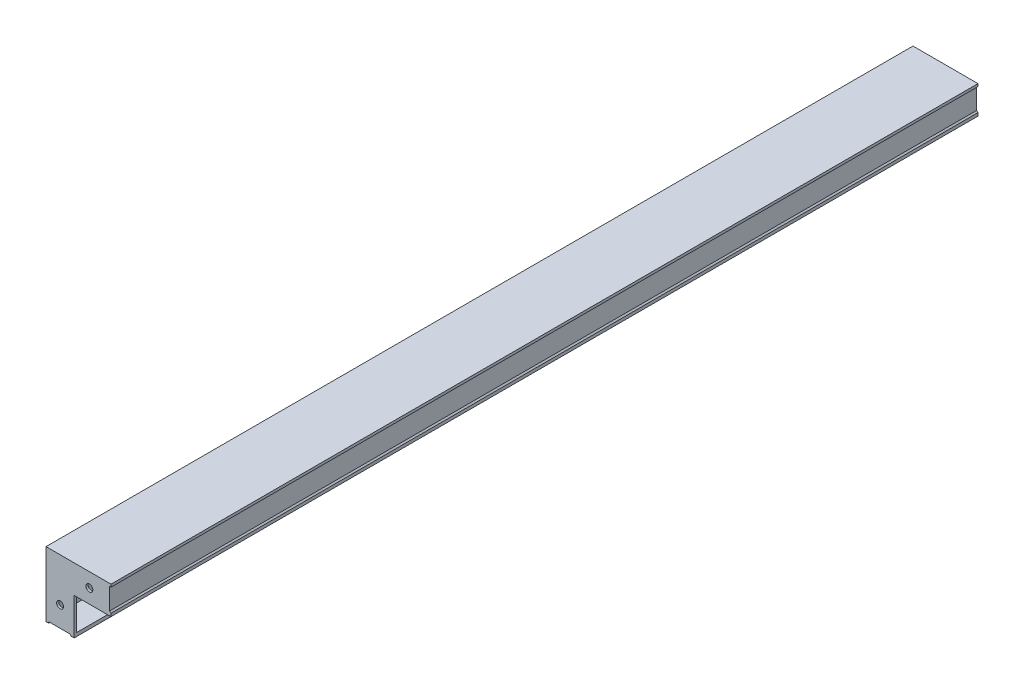
ISO-10303-21;
HEADER;
FILE_DESCRIPTION(('STEP AP214'),'2;1');
FILE_NAME('part.step','',(''),(''),'','','');
FILE_SCHEMA(('AUTOMOTIVE_DESIGN { 1 0 10303 214 1 1 1 1 }'));
ENDSEC;
DATA;
#1=APPLICATION_CONTEXT('core data for automotive mechanical design processes');
#2=APPLICATION_PROTOCOL_DEFINITION('international standard','automotive_design',2000,#1);
#3=PRODUCT_CONTEXT('',#1,'mechanical');
#4=PRODUCT('Part','Part','',(#3));
#5=PRODUCT_RELATED_PRODUCT_CATEGORY('part','',(#4));
#6=PRODUCT_DEFINITION_FORMATION('','',#4);
#7=PRODUCT_DEFINITION_CONTEXT('part definition',#1,'design');
#8=PRODUCT_DEFINITION('design','',#6,#7);
#9=PRODUCT_DEFINITION_SHAPE('','',#8);
#10=(LENGTH_UNIT() NAMED_UNIT(*) SI_UNIT(.MILLI.,.METRE.));
#11=(NAMED_UNIT(*) PLANE_ANGLE_UNIT() SI_UNIT($,.RADIAN.));
#12=(NAMED_UNIT(*) SI_UNIT($,.STERADIAN.) SOLID_ANGLE_UNIT());
#13=UNCERTAINTY_MEASURE_WITH_UNIT(LENGTH_MEASURE(1.E-05),#10,'distance_accuracy_value','');
#14=(GEOMETRIC_REPRESENTATION_CONTEXT(3) GLOBAL_UNCERTAINTY_ASSIGNED_CONTEXT((#13)) GLOBAL_UNIT_ASSIGNED_CONTEXT((#10,
#11,#12)) REPRESENTATION_CONTEXT('',''));
#15=CARTESIAN_POINT('',(0.,0.,0.));
#16=DIRECTION('',(0.,0.,1.));
#17=DIRECTION('',(1.,0.,0.));
#18=AXIS2_PLACEMENT_3D('',#15,#16,#17);
#19=CARTESIAN_POINT('',(8.99999999995733,-8.99999999998687,2000.));
#20=DIRECTION('',(0.,0.,-1.));
#21=DIRECTION('',(-1.,0.,0.));
#22=AXIS2_PLACEMENT_3D('',#19,#20,#21);
#23=CYLINDRICAL_SURFACE('',#22,2.99999999998663);
#24=DIRECTION('',(0.,0.,-1.));
#25=VECTOR('',#24,1.);
#26=CARTESIAN_POINT('',(5.9999999999707,-8.99999999998688,2000.));
#27=LINE('',#26,#25);
#28=CARTESIAN_POINT('',(5.9999999999707,-8.99999999998688,1995.));
#29=VERTEX_POINT('',#28);
#30=CARTESIAN_POINT('',(5.9999999999707,-8.99999999998688,4.99999999999989));
#31=VERTEX_POINT('',#30);
#32=EDGE_CURVE('E264',#29,#31,#27,.T.);
#33=ORIENTED_EDGE('',*,*,#32,.T.);
#34=CARTESIAN_POINT('',(8.99999999995733,-8.99999999998687,4.99999999999989));
#35=DIRECTION('',(0.,0.,1.));
#36=DIRECTION('',(1.,0.,0.));
#37=AXIS2_PLACEMENT_3D('',#34,#35,#36);
#38=CIRCLE('',#37,2.99999999998663);
#39=CARTESIAN_POINT('',(8.99999999995733,-6.00000000000025,4.99999999999989));
#40=VERTEX_POINT('',#39);
#41=EDGE_CURVE('E48',#31,#40,#38,.F.);
#42=ORIENTED_EDGE('',*,*,#41,.T.);
#43=DIRECTION('',(0.,0.,-1.));
#44=VECTOR('',#43,1.);
#45=CARTESIAN_POINT('',(8.99999999995733,-6.00000000000025,2000.));
#46=LINE('',#45,#44);
#47=CARTESIAN_POINT('',(8.99999999995733,-6.00000000000021,1995.));
#48=VERTEX_POINT('',#47);
#49=EDGE_CURVE('E11',#48,#40,#46,.T.);
#50=ORIENTED_EDGE('',*,*,#49,.F.);
#51=CARTESIAN_POINT('',(8.99999999995733,-8.99999999998687,1995.));
#52=DIRECTION('',(0.,0.,-1.));
#53=DIRECTION('',(-1.,0.,0.));
#54=AXIS2_PLACEMENT_3D('',#51,#52,#53);
#55=CIRCLE('',#54,2.99999999998663);
#56=EDGE_CURVE('E231',#48,#29,#55,.F.);
#57=ORIENTED_EDGE('',*,*,#56,.T.);
#58=EDGE_LOOP('',(#33,#42,#50,#57));
#59=FACE_BOUND('',#58,.T.);
#60=ADVANCED_FACE('F32',(#59),#23,.F.);
#61=CARTESIAN_POINT('',(8.99999999995733,-6.00000000000025,2000.));
#62=DIRECTION('',(0.,1.,0.));
#63=DIRECTION('',(-1.,0.,0.));
#64=AXIS2_PLACEMENT_3D('',#61,#62,#63);
#65=PLANE('',#64);
#66=ORIENTED_EDGE('',*,*,#49,.T.);
#67=DIRECTION('',(-1.,0.,0.));
#68=VECTOR('',#67,1.);
#69=CARTESIAN_POINT('',(5.9999999999707,-6.00000000000021,5.));
#70=LINE('',#69,#68);
#71=CARTESIAN_POINT('',(141.999999999995,-6.00000000000021,4.99999999999989));
#72=VERTEX_POINT('',#71);
#73=EDGE_CURVE('E54',#72,#40,#70,.T.);
#74=ORIENTED_EDGE('',*,*,#73,.F.);
#75=DIRECTION('',(0.,0.,-1.));
#76=VECTOR('',#75,1.);
#77=CARTESIAN_POINT('',(141.999999999995,-6.00000000000021,2000.));
#78=LINE('',#77,#76);
#79=CARTESIAN_POINT('',(141.999999999995,-6.00000000000021,1995.));
#80=VERTEX_POINT('',#79);
#81=EDGE_CURVE('E40',#80,#72,#78,.T.);
#82=ORIENTED_EDGE('',*,*,#81,.F.);
#83=DIRECTION('',(-1.,0.,0.));
#84=VECTOR('',#83,1.);
#85=CARTESIAN_POINT('',(5.9999999999707,-6.00000000000021,1995.));
#86=LINE('',#85,#84);
#87=EDGE_CURVE('E225',#80,#48,#86,.T.);
#88=ORIENTED_EDGE('',*,*,#87,.T.);
#89=EDGE_LOOP('',(#66,#74,#82,#88));
#90=FACE_BOUND('',#89,.T.);
#91=ADVANCED_FACE('F357',(#90),#65,.F.);
#92=CARTESIAN_POINT('',(141.999999999995,-64.9999999999834,2000.));
#93=DIRECTION('',(1.,0.,0.));
#94=DIRECTION('',(0.,0.,-1.));
#95=AXIS2_PLACEMENT_3D('',#92,#93,#94);
#96=PLANE('',#95);
#97=ORIENTED_EDGE('',*,*,#81,.T.);
#98=DIRECTION('',(0.,1.,0.));
#99=VECTOR('',#98,1.);
#100=CARTESIAN_POINT('',(141.999999999995,-64.9999999999834,5.));
#101=LINE('',#100,#99);
#102=CARTESIAN_POINT('',(141.999999999995,-64.9999999999834,4.99999999999989));
#103=VERTEX_POINT('',#102);
#104=EDGE_CURVE('E204',#103,#72,#101,.T.);
#105=ORIENTED_EDGE('',*,*,#104,.F.);
#106=DIRECTION('',(0.,0.,-1.));
#107=VECTOR('',#106,1.);
#108=CARTESIAN_POINT('',(141.999999999995,-64.9999999999834,2000.));
#109=LINE('',#108,#107);
#110=CARTESIAN_POINT('',(141.999999999995,-64.9999999999834,1995.));
#111=VERTEX_POINT('',#110);
#112=EDGE_CURVE('E203',#111,#103,#109,.T.);
#113=ORIENTED_EDGE('',*,*,#112,.F.);
#114=DIRECTION('',(0.,1.,0.));
#115=VECTOR('',#114,1.);
#116=CARTESIAN_POINT('',(141.999999999995,-64.9999999999834,1995.));
#117=LINE('',#116,#115);
#118=EDGE_CURVE('E222',#111,#80,#117,.T.);
#119=ORIENTED_EDGE('',*,*,#118,.T.);
#120=EDGE_LOOP('',(#97,#105,#113,#119));
#121=FACE_BOUND('',#120,.T.);
#122=ADVANCED_FACE('F356',(#121),#96,.F.);
#123=CARTESIAN_POINT('',(150.,-64.9999999999834,2000.));
#124=DIRECTION('',(0.,1.,0.));
#125=DIRECTION('',(0.,0.,1.));
#126=AXIS2_PLACEMENT_3D('',#123,#124,#125);
#127=PLANE('',#126);
#128=DIRECTION('',(1.,0.,0.));
#129=VECTOR('',#128,1.);
#130=CARTESIAN_POINT('',(150.,-64.9999999999834,0.));
#131=LINE('',#130,#129);
#132=CARTESIAN_POINT('',(64.9999999999995,-64.9999999999834,0.));
#133=VERTEX_POINT('',#132);
#134=CARTESIAN_POINT('',(150.,-64.9999999999834,0.));
#135=VERTEX_POINT('',#134);
#136=EDGE_CURVE('E234',#133,#135,#131,.T.);
#137=ORIENTED_EDGE('',*,*,#136,.T.);
#138=DIRECTION('',(0.,0.,-1.));
#139=VECTOR('',#138,1.);
#140=CARTESIAN_POINT('',(150.,-64.9999999999834,2000.));
#141=LINE('',#140,#139);
#142=CARTESIAN_POINT('',(150.,-64.9999999999834,2000.));
#143=VERTEX_POINT('',#142);
#144=EDGE_CURVE('E332',#143,#135,#141,.T.);
#145=ORIENTED_EDGE('',*,*,#144,.F.);
#146=DIRECTION('',(1.,0.,0.));
#147=VECTOR('',#146,1.);
#148=CARTESIAN_POINT('',(150.,-64.9999999999834,2000.));
#149=LINE('',#148,#147);
#150=CARTESIAN_POINT('',(64.9999999999995,-64.9999999999834,2000.));
#151=VERTEX_POINT('',#150);
#152=EDGE_CURVE('E235',#151,#143,#149,.T.);
#153=ORIENTED_EDGE('',*,*,#152,.F.);
#154=DIRECTION('',(0.,0.,1.));
#155=VECTOR('',#154,1.);
#156=CARTESIAN_POINT('',(64.9999999999995,-64.9999999999834,1995.));
#157=LINE('',#156,#155);
#158=CARTESIAN_POINT('',(64.9999999999995,-64.9999999999834,1995.));
#159=VERTEX_POINT('',#158);
#160=EDGE_CURVE('E228',#159,#151,#157,.T.);
#161=ORIENTED_EDGE('',*,*,#160,.F.);
#162=DIRECTION('',(1.,0.,0.));
#163=VECTOR('',#162,1.);
#164=CARTESIAN_POINT('',(141.999999999995,-64.9999999999834,1995.));
#165=LINE('',#164,#163);
#166=EDGE_CURVE('E220',#159,#111,#165,.T.);
#167=ORIENTED_EDGE('',*,*,#166,.T.);
#168=ORIENTED_EDGE('',*,*,#112,.T.);
#169=DIRECTION('',(1.,0.,0.));
#170=VECTOR('',#169,1.);
#171=CARTESIAN_POINT('',(141.999999999995,-64.9999999999834,5.));
#172=LINE('',#171,#170);
#173=CARTESIAN_POINT('',(64.9999999999995,-64.9999999999834,5.));
#174=VERTEX_POINT('',#173);
#175=EDGE_CURVE('E184',#174,#103,#172,.T.);
#176=ORIENTED_EDGE('',*,*,#175,.F.);
#177=DIRECTION('',(0.,0.,-1.));
#178=VECTOR('',#177,1.);
#179=CARTESIAN_POINT('',(64.9999999999995,-64.9999999999834,5.));
#180=LINE('',#179,#178);
#181=EDGE_CURVE('E191',#174,#133,#180,.T.);
#182=ORIENTED_EDGE('',*,*,#181,.T.);
#183=EDGE_LOOP('',(#137,#145,#153,#161,#167,#168,#176,#182));
#184=FACE_BOUND('',#183,.T.);
#185=ADVANCED_FACE('F200',(#184),#127,.F.);
#186=CARTESIAN_POINT('',(150.,-57.9999999999965,2000.));
#187=DIRECTION('',(-1.,0.,0.));
#188=DIRECTION('',(0.,0.,1.));
#189=AXIS2_PLACEMENT_3D('',#186,#187,#188);
#190=PLANE('',#189);
#191=DIRECTION('',(0.,1.,0.));
#192=VECTOR('',#191,1.);
#193=CARTESIAN_POINT('',(150.,-57.9999999999965,0.));
#194=LINE('',#193,#192);
#195=CARTESIAN_POINT('',(150.,-57.9999999999965,0.));
#196=VERTEX_POINT('',#195);
#197=EDGE_CURVE('E266',#135,#196,#194,.T.);
#198=ORIENTED_EDGE('',*,*,#197,.T.);
#199=DIRECTION('',(0.,0.,-1.));
#200=VECTOR('',#199,1.);
#201=CARTESIAN_POINT('',(150.,-57.9999999999965,2000.));
#202=LINE('',#201,#200);
#203=CARTESIAN_POINT('',(150.,-57.9999999999965,2000.));
#204=VERTEX_POINT('',#203);
#205=EDGE_CURVE('E329',#204,#196,#202,.T.);
#206=ORIENTED_EDGE('',*,*,#205,.F.);
#207=DIRECTION('',(0.,1.,0.));
#208=VECTOR('',#207,1.);
#209=CARTESIAN_POINT('',(150.,-57.9999999999965,2000.));
#210=LINE('',#209,#208);
#211=EDGE_CURVE('E237',#143,#204,#210,.T.);
#212=ORIENTED_EDGE('',*,*,#211,.F.);
#213=ORIENTED_EDGE('',*,*,#144,.T.);
#214=EDGE_LOOP('',(#198,#206,#212,#213));
#215=FACE_BOUND('',#214,.T.);
#216=ADVANCED_FACE('F382',(#215),#190,.F.);
#217=CARTESIAN_POINT('',(147.000000000021,-55.0000000000175,2000.));
#218=DIRECTION('',(-0.707106781186532,-0.707106781186563,0.));
#219=DIRECTION('',(0.707106781186563,-0.707106781186532,0.));
#220=AXIS2_PLACEMENT_3D('',#217,#218,#219);
#221=PLANE('',#220);
#222=DIRECTION('',(-0.707106781186563,0.707106781186532,0.));
#223=VECTOR('',#222,1.);
#224=CARTESIAN_POINT('',(147.000000000021,-55.0000000000175,0.));
#225=LINE('',#224,#223);
#226=CARTESIAN_POINT('',(147.000000000021,-55.0000000000175,0.));
#227=VERTEX_POINT('',#226);
#228=EDGE_CURVE('E268',#196,#227,#225,.T.);
#229=ORIENTED_EDGE('',*,*,#228,.T.);
#230=DIRECTION('',(0.,0.,-1.));
#231=VECTOR('',#230,1.);
#232=CARTESIAN_POINT('',(147.000000000021,-55.0000000000175,2000.));
#233=LINE('',#232,#231);
#234=CARTESIAN_POINT('',(147.000000000021,-55.0000000000175,2000.));
#235=VERTEX_POINT('',#234);
#236=EDGE_CURVE('E326',#235,#227,#233,.T.);
#237=ORIENTED_EDGE('',*,*,#236,.F.);
#238=DIRECTION('',(-0.707106781186563,0.707106781186532,0.));
#239=VECTOR('',#238,1.);
#240=CARTESIAN_POINT('',(147.000000000021,-55.0000000000175,2000.));
#241=LINE('',#240,#239);
#242=EDGE_CURVE('E239',#204,#235,#241,.T.);
#243=ORIENTED_EDGE('',*,*,#242,.F.);
#244=ORIENTED_EDGE('',*,*,#205,.T.);
#245=EDGE_LOOP('',(#229,#237,#243,#244));
#246=FACE_BOUND('',#245,.T.);
#247=ADVANCED_FACE('F389',(#246),#221,.F.);
#248=CARTESIAN_POINT('',(147.000000000021,-6.00000000000021,2000.));
#249=DIRECTION('',(-1.,0.,0.));
#250=DIRECTION('',(0.,-1.,0.));
#251=AXIS2_PLACEMENT_3D('',#248,#249,#250);
#252=PLANE('',#251);
#253=DIRECTION('',(0.,1.,0.));
#254=VECTOR('',#253,1.);
#255=CARTESIAN_POINT('',(147.000000000021,-6.00000000000021,0.));
#256=LINE('',#255,#254);
#257=CARTESIAN_POINT('',(147.000000000021,-6.00000000000021,0.));
#258=VERTEX_POINT('',#257);
#259=EDGE_CURVE('E270',#227,#258,#256,.T.);
#260=ORIENTED_EDGE('',*,*,#259,.T.);
#261=DIRECTION('',(0.,0.,-1.));
#262=VECTOR('',#261,1.);
#263=CARTESIAN_POINT('',(147.000000000021,-6.00000000000021,2000.));
#264=LINE('',#263,#262);
#265=CARTESIAN_POINT('',(147.000000000021,-6.00000000000021,2000.));
#266=VERTEX_POINT('',#265);
#267=EDGE_CURVE('E323',#266,#258,#264,.T.);
#268=ORIENTED_EDGE('',*,*,#267,.F.);
#269=DIRECTION('',(0.,1.,0.));
#270=VECTOR('',#269,1.);
#271=CARTESIAN_POINT('',(147.000000000021,-6.00000000000021,2000.));
#272=LINE('',#271,#270);
#273=EDGE_CURVE('E241',#235,#266,#272,.T.);
#274=ORIENTED_EDGE('',*,*,#273,.F.);
#275=ORIENTED_EDGE('',*,*,#236,.T.);
#276=EDGE_LOOP('',(#260,#268,#274,#275));
#277=FACE_BOUND('',#276,.T.);
#278=ADVANCED_FACE('F392',(#277),#252,.F.);
#279=CARTESIAN_POINT('',(147.000000000021,-6.00000000000021,2000.));
#280=DIRECTION('',(0.,1.,0.));
#281=DIRECTION('',(-1.,0.,0.));
#282=AXIS2_PLACEMENT_3D('',#279,#280,#281);
#283=PLANE('',#282);
#284=DIRECTION('',(1.,0.,0.));
#285=VECTOR('',#284,1.);
#286=CARTESIAN_POINT('',(147.000000000021,-6.00000000000021,0.));
#287=LINE('',#286,#285);
#288=CARTESIAN_POINT('',(150.,-6.0000000000002,0.));
#289=VERTEX_POINT('',#288);
#290=EDGE_CURVE('E272',#258,#289,#287,.T.);
#291=ORIENTED_EDGE('',*,*,#290,.T.);
#292=DIRECTION('',(0.,0.,-1.));
#293=VECTOR('',#292,1.);
#294=CARTESIAN_POINT('',(150.,-6.0000000000002,2000.));
#295=LINE('',#294,#293);
#296=CARTESIAN_POINT('',(150.,-6.0000000000002,2000.));
#297=VERTEX_POINT('',#296);
#298=EDGE_CURVE('E320',#297,#289,#295,.T.);
#299=ORIENTED_EDGE('',*,*,#298,.F.);
#300=DIRECTION('',(1.,0.,0.));
#301=VECTOR('',#300,1.);
#302=CARTESIAN_POINT('',(147.000000000021,-6.00000000000021,2000.));
#303=LINE('',#302,#301);
#304=EDGE_CURVE('E243',#266,#297,#303,.T.);
#305=ORIENTED_EDGE('',*,*,#304,.F.);
#306=ORIENTED_EDGE('',*,*,#267,.T.);
#307=EDGE_LOOP('',(#291,#299,#305,#306));
#308=FACE_BOUND('',#307,.T.);
#309=ADVANCED_FACE('F397',(#308),#283,.F.);
#310=CARTESIAN_POINT('',(150.,0.,2000.));
#311=DIRECTION('',(-1.,0.,0.));
#312=DIRECTION('',(0.,0.,1.));
#313=AXIS2_PLACEMENT_3D('',#310,#311,#312);
#314=PLANE('',#313);
#315=DIRECTION('',(0.,1.,0.));
#316=VECTOR('',#315,1.);
#317=CARTESIAN_POINT('',(150.,0.,0.));
#318=LINE('',#317,#316);
#319=CARTESIAN_POINT('',(150.,0.,0.));
#320=VERTEX_POINT('',#319);
#321=EDGE_CURVE('E274',#289,#320,#318,.T.);
#322=ORIENTED_EDGE('',*,*,#321,.T.);
#323=DIRECTION('',(0.,0.,-1.));
#324=VECTOR('',#323,1.);
#325=CARTESIAN_POINT('',(150.,0.,2000.));
#326=LINE('',#325,#324);
#327=CARTESIAN_POINT('',(150.,0.,2000.));
#328=VERTEX_POINT('',#327);
#329=EDGE_CURVE('E317',#328,#320,#326,.T.);
#330=ORIENTED_EDGE('',*,*,#329,.F.);
#331=DIRECTION('',(0.,1.,0.));
#332=VECTOR('',#331,1.);
#333=CARTESIAN_POINT('',(150.,0.,2000.));
#334=LINE('',#333,#332);
#335=EDGE_CURVE('E245',#297,#328,#334,.T.);
#336=ORIENTED_EDGE('',*,*,#335,.F.);
#337=ORIENTED_EDGE('',*,*,#298,.T.);
#338=EDGE_LOOP('',(#322,#330,#336,#337));
#339=FACE_BOUND('',#338,.T.);
#340=ADVANCED_FACE('F403',(#339),#314,.F.);
#341=CARTESIAN_POINT('',(150.,0.,2000.));
#342=DIRECTION('',(0.,-1.,0.));
#343=DIRECTION('',(1.,0.,0.));
#344=AXIS2_PLACEMENT_3D('',#341,#342,#343);
#345=PLANE('',#344);
#346=DIRECTION('',(-1.,0.,0.));
#347=VECTOR('',#346,1.);
#348=CARTESIAN_POINT('',(150.,0.,0.));
#349=LINE('',#348,#347);
#350=CARTESIAN_POINT('',(0.,0.,0.));
#351=VERTEX_POINT('',#350);
#352=EDGE_CURVE('E276',#320,#351,#349,.T.);
#353=ORIENTED_EDGE('',*,*,#352,.T.);
#354=DIRECTION('',(0.,0.,-1.));
#355=VECTOR('',#354,1.);
#356=CARTESIAN_POINT('',(0.,0.,2000.));
#357=LINE('',#356,#355);
#358=CARTESIAN_POINT('',(0.,0.,2000.));
#359=VERTEX_POINT('',#358);
#360=EDGE_CURVE('E314',#359,#351,#357,.T.);
#361=ORIENTED_EDGE('',*,*,#360,.F.);
#362=DIRECTION('',(-1.,0.,0.));
#363=VECTOR('',#362,1.);
#364=CARTESIAN_POINT('',(150.,0.,2000.));
#365=LINE('',#364,#363);
#366=EDGE_CURVE('E247',#328,#359,#365,.T.);
#367=ORIENTED_EDGE('',*,*,#366,.F.);
#368=ORIENTED_EDGE('',*,*,#329,.T.);
#369=EDGE_LOOP('',(#353,#361,#367,#368));
#370=FACE_BOUND('',#369,.T.);
#371=ADVANCED_FACE('F407',(#370),#345,.F.);
#372=CARTESIAN_POINT('',(0.,-149.999999999985,2000.));
#373=DIRECTION('',(1.,0.,0.));
#374=DIRECTION('',(0.,0.,-1.));
#375=AXIS2_PLACEMENT_3D('',#372,#373,#374);
#376=PLANE('',#375);
#377=DIRECTION('',(0.,-1.,0.));
#378=VECTOR('',#377,1.);
#379=CARTESIAN_POINT('',(0.,-149.999999999985,0.));
#380=LINE('',#379,#378);
#381=CARTESIAN_POINT('',(0.,-149.999999999985,0.));
#382=VERTEX_POINT('',#381);
#383=EDGE_CURVE('E278',#351,#382,#380,.T.);
#384=ORIENTED_EDGE('',*,*,#383,.T.);
#385=DIRECTION('',(0.,0.,-1.));
#386=VECTOR('',#385,1.);
#387=CARTESIAN_POINT('',(0.,-149.999999999985,2000.));
#388=LINE('',#387,#386);
#389=CARTESIAN_POINT('',(0.,-149.999999999985,2000.));
#390=VERTEX_POINT('',#389);
#391=EDGE_CURVE('E311',#390,#382,#388,.T.);
#392=ORIENTED_EDGE('',*,*,#391,.F.);
#393=DIRECTION('',(0.,-1.,0.));
#394=VECTOR('',#393,1.);
#395=CARTESIAN_POINT('',(0.,-149.999999999985,2000.));
#396=LINE('',#395,#394);
#397=EDGE_CURVE('E249',#359,#390,#396,.T.);
#398=ORIENTED_EDGE('',*,*,#397,.F.);
#399=ORIENTED_EDGE('',*,*,#360,.T.);
#400=EDGE_LOOP('',(#384,#392,#398,#399));
#401=FACE_BOUND('',#400,.T.);
#402=ADVANCED_FACE('F412',(#401),#376,.F.);
#403=CARTESIAN_POINT('',(5.9999999999707,-149.999999999985,2000.));
#404=DIRECTION('',(0.,1.,0.));
#405=DIRECTION('',(0.,0.,1.));
#406=AXIS2_PLACEMENT_3D('',#403,#404,#405);
#407=PLANE('',#406);
#408=DIRECTION('',(1.,0.,0.));
#409=VECTOR('',#408,1.);
#410=CARTESIAN_POINT('',(5.9999999999707,-149.999999999985,0.));
#411=LINE('',#410,#409);
#412=CARTESIAN_POINT('',(5.9999999999707,-149.999999999985,0.));
#413=VERTEX_POINT('',#412);
#414=EDGE_CURVE('E280',#382,#413,#411,.T.);
#415=ORIENTED_EDGE('',*,*,#414,.T.);
#416=DIRECTION('',(0.,0.,-1.));
#417=VECTOR('',#416,1.);
#418=CARTESIAN_POINT('',(5.9999999999707,-149.999999999985,2000.));
#419=LINE('',#418,#417);
#420=CARTESIAN_POINT('',(5.9999999999707,-149.999999999985,2000.));
#421=VERTEX_POINT('',#420);
#422=EDGE_CURVE('E308',#421,#413,#419,.T.);
#423=ORIENTED_EDGE('',*,*,#422,.F.);
#424=DIRECTION('',(1.,0.,0.));
#425=VECTOR('',#424,1.);
#426=CARTESIAN_POINT('',(5.9999999999707,-149.999999999985,2000.));
#427=LINE('',#426,#425);
#428=EDGE_CURVE('E251',#390,#421,#427,.T.);
#429=ORIENTED_EDGE('',*,*,#428,.F.);
#430=ORIENTED_EDGE('',*,*,#391,.T.);
#431=EDGE_LOOP('',(#415,#423,#429,#430));
#432=FACE_BOUND('',#431,.T.);
#433=ADVANCED_FACE('F418',(#432),#407,.F.);
#434=CARTESIAN_POINT('',(5.9999999999707,-149.999999999985,2000.));
#435=DIRECTION('',(-1.,0.,0.));
#436=DIRECTION('',(0.,-1.,0.));
#437=AXIS2_PLACEMENT_3D('',#434,#435,#436);
#438=PLANE('',#437);
#439=DIRECTION('',(0.,1.,0.));
#440=VECTOR('',#439,1.);
#441=CARTESIAN_POINT('',(5.9999999999707,-149.999999999985,0.));
#442=LINE('',#441,#440);
#443=CARTESIAN_POINT('',(5.9999999999707,-146.999999999985,0.));
#444=VERTEX_POINT('',#443);
#445=EDGE_CURVE('E282',#413,#444,#442,.T.);
#446=ORIENTED_EDGE('',*,*,#445,.T.);
#447=DIRECTION('',(0.,0.,-1.));
#448=VECTOR('',#447,1.);
#449=CARTESIAN_POINT('',(5.9999999999707,-146.999999999985,2000.));
#450=LINE('',#449,#448);
#451=CARTESIAN_POINT('',(5.9999999999707,-146.999999999985,2000.));
#452=VERTEX_POINT('',#451);
#453=EDGE_CURVE('E305',#452,#444,#450,.T.);
#454=ORIENTED_EDGE('',*,*,#453,.F.);
#455=DIRECTION('',(0.,1.,0.));
#456=VECTOR('',#455,1.);
#457=CARTESIAN_POINT('',(5.9999999999707,-149.999999999985,2000.));
#458=LINE('',#457,#456);
#459=EDGE_CURVE('E253',#421,#452,#458,.T.);
#460=ORIENTED_EDGE('',*,*,#459,.F.);
#461=ORIENTED_EDGE('',*,*,#422,.T.);
#462=EDGE_LOOP('',(#446,#454,#460,#461));
#463=FACE_BOUND('',#462,.T.);
#464=ADVANCED_FACE('F422',(#463),#438,.F.);
#465=CARTESIAN_POINT('',(54.9999999999997,-146.999999999985,2000.));
#466=DIRECTION('',(0.,1.,0.));
#467=DIRECTION('',(0.,0.,1.));
#468=AXIS2_PLACEMENT_3D('',#465,#466,#467);
#469=PLANE('',#468);
#470=DIRECTION('',(1.,0.,0.));
#471=VECTOR('',#470,1.);
#472=CARTESIAN_POINT('',(54.9999999999997,-146.999999999985,0.));
#473=LINE('',#472,#471);
#474=CARTESIAN_POINT('',(54.9999999999997,-146.999999999985,0.));
#475=VERTEX_POINT('',#474);
#476=EDGE_CURVE('E284',#444,#475,#473,.T.);
#477=ORIENTED_EDGE('',*,*,#476,.T.);
#478=DIRECTION('',(0.,0.,-1.));
#479=VECTOR('',#478,1.);
#480=CARTESIAN_POINT('',(54.9999999999997,-146.999999999985,2000.));
#481=LINE('',#480,#479);
#482=CARTESIAN_POINT('',(54.9999999999997,-146.999999999985,2000.));
#483=VERTEX_POINT('',#482);
#484=EDGE_CURVE('E302',#483,#475,#481,.T.);
#485=ORIENTED_EDGE('',*,*,#484,.F.);
#486=DIRECTION('',(1.,0.,0.));
#487=VECTOR('',#486,1.);
#488=CARTESIAN_POINT('',(54.9999999999997,-146.999999999985,2000.));
#489=LINE('',#488,#487);
#490=EDGE_CURVE('E255',#452,#483,#489,.T.);
#491=ORIENTED_EDGE('',*,*,#490,.F.);
#492=ORIENTED_EDGE('',*,*,#453,.T.);
#493=EDGE_LOOP('',(#477,#485,#491,#492));
#494=FACE_BOUND('',#493,.T.);
#495=ADVANCED_FACE('F427',(#494),#469,.F.);
#496=CARTESIAN_POINT('',(57.9999999999998,-149.999999999985,2000.));
#497=DIRECTION('',(0.707106781186547,0.707106781186548,0.));
#498=DIRECTION('',(-0.707106781186548,0.707106781186547,0.));
#499=AXIS2_PLACEMENT_3D('',#496,#497,#498);
#500=PLANE('',#499);
#501=DIRECTION('',(0.707106781186548,-0.707106781186547,0.));
#502=VECTOR('',#501,1.);
#503=CARTESIAN_POINT('',(57.9999999999998,-149.999999999985,0.));
#504=LINE('',#503,#502);
#505=CARTESIAN_POINT('',(57.9999999999998,-149.999999999985,0.));
#506=VERTEX_POINT('',#505);
#507=EDGE_CURVE('E286',#475,#506,#504,.T.);
#508=ORIENTED_EDGE('',*,*,#507,.T.);
#509=DIRECTION('',(0.,0.,-1.));
#510=VECTOR('',#509,1.);
#511=CARTESIAN_POINT('',(57.9999999999998,-149.999999999985,2000.));
#512=LINE('',#511,#510);
#513=CARTESIAN_POINT('',(57.9999999999998,-149.999999999985,2000.));
#514=VERTEX_POINT('',#513);
#515=EDGE_CURVE('E299',#514,#506,#512,.T.);
#516=ORIENTED_EDGE('',*,*,#515,.F.);
#517=DIRECTION('',(0.707106781186548,-0.707106781186547,0.));
#518=VECTOR('',#517,1.);
#519=CARTESIAN_POINT('',(57.9999999999998,-149.999999999985,2000.));
#520=LINE('',#519,#518);
#521=EDGE_CURVE('E257',#483,#514,#520,.T.);
#522=ORIENTED_EDGE('',*,*,#521,.F.);
#523=ORIENTED_EDGE('',*,*,#484,.T.);
#524=EDGE_LOOP('',(#508,#516,#522,#523));
#525=FACE_BOUND('',#524,.T.);
#526=ADVANCED_FACE('F431',(#525),#500,.F.);
#527=CARTESIAN_POINT('',(57.9999999999998,-149.999999999985,2000.));
#528=DIRECTION('',(0.,1.,0.));
#529=DIRECTION('',(0.,0.,1.));
#530=AXIS2_PLACEMENT_3D('',#527,#528,#529);
#531=PLANE('',#530);
#532=DIRECTION('',(1.,0.,0.));
#533=VECTOR('',#532,1.);
#534=CARTESIAN_POINT('',(57.9999999999998,-149.999999999985,0.));
#535=LINE('',#534,#533);
#536=CARTESIAN_POINT('',(64.9999999999995,-149.999999999985,0.));
#537=VERTEX_POINT('',#536);
#538=EDGE_CURVE('E288',#506,#537,#535,.T.);
#539=ORIENTED_EDGE('',*,*,#538,.T.);
#540=DIRECTION('',(0.,0.,-1.));
#541=VECTOR('',#540,1.);
#542=CARTESIAN_POINT('',(64.9999999999995,-149.999999999985,2000.));
#543=LINE('',#542,#541);
#544=CARTESIAN_POINT('',(64.9999999999995,-149.999999999985,2000.));
#545=VERTEX_POINT('',#544);
#546=EDGE_CURVE('E297',#545,#537,#543,.T.);
#547=ORIENTED_EDGE('',*,*,#546,.F.);
#548=DIRECTION('',(1.,0.,0.));
#549=VECTOR('',#548,1.);
#550=CARTESIAN_POINT('',(57.9999999999998,-149.999999999985,2000.));
#551=LINE('',#550,#549);
#552=EDGE_CURVE('E259',#514,#545,#551,.T.);
#553=ORIENTED_EDGE('',*,*,#552,.F.);
#554=ORIENTED_EDGE('',*,*,#515,.T.);
#555=EDGE_LOOP('',(#539,#547,#553,#554));
#556=FACE_BOUND('',#555,.T.);
#557=ADVANCED_FACE('F432',(#556),#531,.F.);
#558=CARTESIAN_POINT('',(64.9999999999995,-149.999999999985,2000.));
#559=DIRECTION('',(-1.,0.,0.));
#560=DIRECTION('',(0.,0.,1.));
#561=AXIS2_PLACEMENT_3D('',#558,#559,#560);
#562=PLANE('',#561);
#563=DIRECTION('',(0.,1.,0.));
#564=VECTOR('',#563,1.);
#565=CARTESIAN_POINT('',(64.9999999999995,-149.999999999985,0.));
#566=LINE('',#565,#564);
#567=EDGE_CURVE('E195',#537,#133,#566,.T.);
#568=ORIENTED_EDGE('',*,*,#567,.T.);
#569=ORIENTED_EDGE('',*,*,#181,.F.);
#570=DIRECTION('',(0.,1.,0.));
#571=VECTOR('',#570,1.);
#572=CARTESIAN_POINT('',(64.9999999999995,-141.999999999999,5.));
#573=LINE('',#572,#571);
#574=CARTESIAN_POINT('',(64.9999999999995,-141.999999999999,4.99999999999989));
#575=VERTEX_POINT('',#574);
#576=EDGE_CURVE('E179',#575,#174,#573,.T.);
#577=ORIENTED_EDGE('',*,*,#576,.F.);
#578=DIRECTION('',(0.,0.,-1.));
#579=VECTOR('',#578,1.);
#580=CARTESIAN_POINT('',(64.9999999999995,-141.999999999999,2000.));
#581=LINE('',#580,#579);
#582=CARTESIAN_POINT('',(64.9999999999995,-141.999999999999,1995.));
#583=VERTEX_POINT('',#582);
#584=EDGE_CURVE('E295',#583,#575,#581,.T.);
#585=ORIENTED_EDGE('',*,*,#584,.F.);
#586=DIRECTION('',(0.,1.,0.));
#587=VECTOR('',#586,1.);
#588=CARTESIAN_POINT('',(64.9999999999995,-141.999999999999,1995.));
#589=LINE('',#588,#587);
#590=EDGE_CURVE('E217',#583,#159,#589,.T.);
#591=ORIENTED_EDGE('',*,*,#590,.T.);
#592=ORIENTED_EDGE('',*,*,#160,.T.);
#593=DIRECTION('',(0.,1.,0.));
#594=VECTOR('',#593,1.);
#595=CARTESIAN_POINT('',(64.9999999999995,-149.999999999985,2000.));
#596=LINE('',#595,#594);
#597=EDGE_CURVE('E261',#545,#151,#596,.T.);
#598=ORIENTED_EDGE('',*,*,#597,.F.);
#599=ORIENTED_EDGE('',*,*,#546,.T.);
#600=EDGE_LOOP('',(#568,#569,#577,#585,#591,#592,#598,#599));
#601=FACE_BOUND('',#600,.T.);
#602=ADVANCED_FACE('F192',(#601),#562,.F.);
#603=CARTESIAN_POINT('',(5.9999999999707,-141.999999999999,2000.));
#604=DIRECTION('',(0.,-1.,0.));
#605=DIRECTION('',(0.,0.,-1.));
#606=AXIS2_PLACEMENT_3D('',#603,#604,#605);
#607=PLANE('',#606);
#608=ORIENTED_EDGE('',*,*,#584,.T.);
#609=DIRECTION('',(1.,0.,0.));
#610=VECTOR('',#609,1.);
#611=CARTESIAN_POINT('',(5.9999999999707,-141.999999999999,5.));
#612=LINE('',#611,#610);
#613=CARTESIAN_POINT('',(5.9999999999707,-141.999999999999,4.99999999999989));
#614=VERTEX_POINT('',#613);
#615=EDGE_CURVE('E186',#614,#575,#612,.T.);
#616=ORIENTED_EDGE('',*,*,#615,.F.);
#617=DIRECTION('',(0.,0.,-1.));
#618=VECTOR('',#617,1.);
#619=CARTESIAN_POINT('',(5.9999999999707,-141.999999999999,2000.));
#620=LINE('',#619,#618);
#621=CARTESIAN_POINT('',(5.9999999999707,-141.999999999999,1995.));
#622=VERTEX_POINT('',#621);
#623=EDGE_CURVE('E292',#622,#614,#620,.T.);
#624=ORIENTED_EDGE('',*,*,#623,.F.);
#625=DIRECTION('',(1.,0.,0.));
#626=VECTOR('',#625,1.);
#627=CARTESIAN_POINT('',(5.9999999999707,-141.999999999999,1995.));
#628=LINE('',#627,#626);
#629=EDGE_CURVE('E214',#622,#583,#628,.T.);
#630=ORIENTED_EDGE('',*,*,#629,.T.);
#631=EDGE_LOOP('',(#608,#616,#624,#630));
#632=FACE_BOUND('',#631,.T.);
#633=ADVANCED_FACE('F364',(#632),#607,.F.);
#634=CARTESIAN_POINT('',(5.9999999999707,-141.999999999999,2000.));
#635=DIRECTION('',(-1.,0.,0.));
#636=DIRECTION('',(0.,0.,1.));
#637=AXIS2_PLACEMENT_3D('',#634,#635,#636);
#638=PLANE('',#637);
#639=ORIENTED_EDGE('',*,*,#623,.T.);
#640=DIRECTION('',(0.,-1.,0.));
#641=VECTOR('',#640,1.);
#642=CARTESIAN_POINT('',(5.9999999999707,-141.999999999999,5.));
#643=LINE('',#642,#641);
#644=EDGE_CURVE('E343',#31,#614,#643,.T.);
#645=ORIENTED_EDGE('',*,*,#644,.F.);
#646=ORIENTED_EDGE('',*,*,#32,.F.);
#647=DIRECTION('',(0.,-1.,0.));
#648=VECTOR('',#647,1.);
#649=CARTESIAN_POINT('',(5.9999999999707,-141.999999999999,1995.));
#650=LINE('',#649,#648);
#651=EDGE_CURVE('E211',#29,#622,#650,.T.);
#652=ORIENTED_EDGE('',*,*,#651,.T.);
#653=EDGE_LOOP('',(#639,#645,#646,#652));
#654=FACE_BOUND('',#653,.T.);
#655=ADVANCED_FACE('F361',(#654),#638,.F.);
#656=CARTESIAN_POINT('',(8.99999999995733,-8.99999999998687,2000.));
#657=DIRECTION('',(0.,0.,1.));
#658=DIRECTION('',(1.,0.,0.));
#659=AXIS2_PLACEMENT_3D('',#656,#657,#658);
#660=PLANE('',#659);
#661=CARTESIAN_POINT('',(100.,-32.5,2000.));
#662=DIRECTION('',(0.,0.,1.));
#663=DIRECTION('',(1.,0.,0.));
#664=AXIS2_PLACEMENT_3D('',#661,#662,#663);
#665=CIRCLE('',#664,7.99999999999999);
#666=CARTESIAN_POINT('',(108.,-32.5,2000.));
#667=VERTEX_POINT('',#666);
#668=EDGE_CURVE('E613',#667,#667,#665,.T.);
#669=ORIENTED_EDGE('',*,*,#668,.F.);
#670=EDGE_LOOP('',(#669));
#671=FACE_BOUND('',#670,.T.);
#672=CARTESIAN_POINT('',(32.5,-99.9999999999851,2000.));
#673=DIRECTION('',(0.,0.,1.));
#674=DIRECTION('',(1.,0.,0.));
#675=AXIS2_PLACEMENT_3D('',#672,#673,#674);
#676=CIRCLE('',#675,7.99999999999999);
#677=CARTESIAN_POINT('',(40.5,-99.9999999999851,2000.));
#678=VERTEX_POINT('',#677);
#679=EDGE_CURVE('E346',#678,#678,#676,.T.);
#680=ORIENTED_EDGE('',*,*,#679,.F.);
#681=EDGE_LOOP('',(#680));
#682=FACE_BOUND('',#681,.T.);
#683=ORIENTED_EDGE('',*,*,#597,.T.);
#684=ORIENTED_EDGE('',*,*,#152,.T.);
#685=ORIENTED_EDGE('',*,*,#211,.T.);
#686=ORIENTED_EDGE('',*,*,#242,.T.);
#687=ORIENTED_EDGE('',*,*,#273,.T.);
#688=ORIENTED_EDGE('',*,*,#304,.T.);
#689=ORIENTED_EDGE('',*,*,#335,.T.);
#690=ORIENTED_EDGE('',*,*,#366,.T.);
#691=ORIENTED_EDGE('',*,*,#397,.T.);
#692=ORIENTED_EDGE('',*,*,#428,.T.);
#693=ORIENTED_EDGE('',*,*,#459,.T.);
#694=ORIENTED_EDGE('',*,*,#490,.T.);
#695=ORIENTED_EDGE('',*,*,#521,.T.);
#696=ORIENTED_EDGE('',*,*,#552,.T.);
#697=EDGE_LOOP('',(#683,#684,#685,#686,#687,#688,#689,#690,#691,#692,#693,#694,#695,#696));
#698=FACE_BOUND('',#697,.T.);
#699=ADVANCED_FACE('F371',(#671,#682,#698),#660,.T.);
#700=CARTESIAN_POINT('',(8.99999999995733,-8.99999999998687,0.));
#701=DIRECTION('',(0.,0.,1.));
#702=DIRECTION('',(1.,0.,0.));
#703=AXIS2_PLACEMENT_3D('',#700,#701,#702);
#704=PLANE('',#703);
#705=CARTESIAN_POINT('',(100.,-32.5,0.));
#706=DIRECTION('',(0.,0.,1.));
#707=DIRECTION('',(1.,0.,0.));
#708=AXIS2_PLACEMENT_3D('',#705,#706,#707);
#709=CIRCLE('',#708,7.99999999999976);
#710=CARTESIAN_POINT('',(108.,-32.5,0.));
#711=VERTEX_POINT('',#710);
#712=EDGE_CURVE('E614',#711,#711,#709,.T.);
#713=ORIENTED_EDGE('',*,*,#712,.T.);
#714=EDGE_LOOP('',(#713));
#715=FACE_BOUND('',#714,.T.);
#716=CARTESIAN_POINT('',(32.5,-99.9999999999851,0.));
#717=DIRECTION('',(0.,0.,1.));
#718=DIRECTION('',(1.,0.,0.));
#719=AXIS2_PLACEMENT_3D('',#716,#717,#718);
#720=CIRCLE('',#719,7.99999999999976);
#721=CARTESIAN_POINT('',(40.4999999999998,-99.9999999999851,0.));
#722=VERTEX_POINT('',#721);
#723=EDGE_CURVE('E339',#722,#722,#720,.T.);
#724=ORIENTED_EDGE('',*,*,#723,.T.);
#725=EDGE_LOOP('',(#724));
#726=FACE_BOUND('',#725,.T.);
#727=ORIENTED_EDGE('',*,*,#136,.F.);
#728=ORIENTED_EDGE('',*,*,#567,.F.);
#729=ORIENTED_EDGE('',*,*,#538,.F.);
#730=ORIENTED_EDGE('',*,*,#507,.F.);
#731=ORIENTED_EDGE('',*,*,#476,.F.);
#732=ORIENTED_EDGE('',*,*,#445,.F.);
#733=ORIENTED_EDGE('',*,*,#414,.F.);
#734=ORIENTED_EDGE('',*,*,#383,.F.);
#735=ORIENTED_EDGE('',*,*,#352,.F.);
#736=ORIENTED_EDGE('',*,*,#321,.F.);
#737=ORIENTED_EDGE('',*,*,#290,.F.);
#738=ORIENTED_EDGE('',*,*,#259,.F.);
#739=ORIENTED_EDGE('',*,*,#228,.F.);
#740=ORIENTED_EDGE('',*,*,#197,.F.);
#741=EDGE_LOOP('',(#727,#728,#729,#730,#731,#732,#733,#734,#735,#736,#737,#738,#739,#740));
#742=FACE_BOUND('',#741,.T.);
#743=ADVANCED_FACE('F377',(#715,#726,#742),#704,.F.);
#744=CARTESIAN_POINT('',(0.,0.,1995.));
#745=DIRECTION('',(0.,0.,-1.));
#746=DIRECTION('',(-1.,0.,0.));
#747=AXIS2_PLACEMENT_3D('',#744,#745,#746);
#748=PLANE('',#747);
#749=CARTESIAN_POINT('',(100.,-32.5,1995.));
#750=DIRECTION('',(0.,0.,-1.));
#751=DIRECTION('',(-1.,0.,0.));
#752=AXIS2_PLACEMENT_3D('',#749,#750,#751);
#753=CIRCLE('',#752,7.99999999999988);
#754=CARTESIAN_POINT('',(92.0000000000001,-32.5,1995.));
#755=VERTEX_POINT('',#754);
#756=EDGE_CURVE('E351',#755,#755,#753,.T.);
#757=ORIENTED_EDGE('',*,*,#756,.F.);
#758=EDGE_LOOP('',(#757));
#759=FACE_BOUND('',#758,.T.);
#760=CARTESIAN_POINT('',(32.5,-99.9999999999851,1995.));
#761=DIRECTION('',(0.,0.,-1.));
#762=DIRECTION('',(-1.,0.,0.));
#763=AXIS2_PLACEMENT_3D('',#760,#761,#762);
#764=CIRCLE('',#763,7.99999999999987);
#765=CARTESIAN_POINT('',(24.5000000000001,-99.9999999999851,1995.));
#766=VERTEX_POINT('',#765);
#767=EDGE_CURVE('E338',#766,#766,#764,.T.);
#768=ORIENTED_EDGE('',*,*,#767,.F.);
#769=EDGE_LOOP('',(#768));
#770=FACE_BOUND('',#769,.T.);
#771=ORIENTED_EDGE('',*,*,#56,.F.);
#772=ORIENTED_EDGE('',*,*,#87,.F.);
#773=ORIENTED_EDGE('',*,*,#118,.F.);
#774=ORIENTED_EDGE('',*,*,#166,.F.);
#775=ORIENTED_EDGE('',*,*,#590,.F.);
#776=ORIENTED_EDGE('',*,*,#629,.F.);
#777=ORIENTED_EDGE('',*,*,#651,.F.);
#778=EDGE_LOOP('',(#771,#772,#773,#774,#775,#776,#777));
#779=FACE_BOUND('',#778,.T.);
#780=ADVANCED_FACE('F367',(#759,#770,#779),#748,.T.);
#781=CARTESIAN_POINT('',(0.,0.,5.));
#782=DIRECTION('',(0.,0.,1.));
#783=DIRECTION('',(-1.,0.,0.));
#784=AXIS2_PLACEMENT_3D('',#781,#782,#783);
#785=PLANE('',#784);
#786=CARTESIAN_POINT('',(100.,-32.5,4.99999999999989));
#787=DIRECTION('',(0.,0.,1.));
#788=DIRECTION('',(1.,0.,0.));
#789=AXIS2_PLACEMENT_3D('',#786,#787,#788);
#790=CIRCLE('',#789,7.99999999999988);
#791=CARTESIAN_POINT('',(108.,-32.5,4.99999999999989));
#792=VERTEX_POINT('',#791);
#793=EDGE_CURVE('E35',#792,#792,#790,.T.);
#794=ORIENTED_EDGE('',*,*,#793,.F.);
#795=EDGE_LOOP('',(#794));
#796=FACE_BOUND('',#795,.T.);
#797=CARTESIAN_POINT('',(32.5,-99.9999999999851,4.99999999999989));
#798=DIRECTION('',(0.,0.,1.));
#799=DIRECTION('',(1.,0.,0.));
#800=AXIS2_PLACEMENT_3D('',#797,#798,#799);
#801=CIRCLE('',#800,7.99999999999987);
#802=CARTESIAN_POINT('',(40.4999999999999,-99.9999999999851,4.99999999999989));
#803=VERTEX_POINT('',#802);
#804=EDGE_CURVE('E336',#803,#803,#801,.T.);
#805=ORIENTED_EDGE('',*,*,#804,.F.);
#806=EDGE_LOOP('',(#805));
#807=FACE_BOUND('',#806,.T.);
#808=ORIENTED_EDGE('',*,*,#41,.F.);
#809=ORIENTED_EDGE('',*,*,#644,.T.);
#810=ORIENTED_EDGE('',*,*,#615,.T.);
#811=ORIENTED_EDGE('',*,*,#576,.T.);
#812=ORIENTED_EDGE('',*,*,#175,.T.);
#813=ORIENTED_EDGE('',*,*,#104,.T.);
#814=ORIENTED_EDGE('',*,*,#73,.T.);
#815=EDGE_LOOP('',(#808,#809,#810,#811,#812,#813,#814));
#816=FACE_BOUND('',#815,.T.);
#817=ADVANCED_FACE('F181',(#796,#807,#816),#785,.T.);
#818=CARTESIAN_POINT('',(32.5,-99.9999999999851,2000.));
#819=DIRECTION('',(0.,0.,1.));
#820=DIRECTION('',(1.,0.,0.));
#821=AXIS2_PLACEMENT_3D('',#818,#819,#820);
#822=CYLINDRICAL_SURFACE('',#821,7.99999999999987);
#823=ORIENTED_EDGE('',*,*,#804,.T.);
#824=EDGE_LOOP('',(#823));
#825=FACE_BOUND('',#824,.T.);
#826=ORIENTED_EDGE('',*,*,#723,.F.);
#827=EDGE_LOOP('',(#826));
#828=FACE_BOUND('',#827,.T.);
#829=ADVANCED_FACE('F567',(#825,#828),#822,.F.);
#830=ORIENTED_EDGE('',*,*,#767,.T.);
#831=EDGE_LOOP('',(#830));
#832=FACE_BOUND('',#831,.T.);
#833=ORIENTED_EDGE('',*,*,#679,.T.);
#834=EDGE_LOOP('',(#833));
#835=FACE_BOUND('',#834,.T.);
#836=ADVANCED_FACE('F577',(#832,#835),#822,.F.);
#837=CARTESIAN_POINT('',(100.,-32.5,2000.));
#838=DIRECTION('',(0.,0.,1.));
#839=DIRECTION('',(1.,0.,0.));
#840=AXIS2_PLACEMENT_3D('',#837,#838,#839);
#841=CYLINDRICAL_SURFACE('',#840,7.99999999999988);
#842=ORIENTED_EDGE('',*,*,#793,.T.);
#843=EDGE_LOOP('',(#842));
#844=FACE_BOUND('',#843,.T.);
#845=ORIENTED_EDGE('',*,*,#712,.F.);
#846=EDGE_LOOP('',(#845));
#847=FACE_BOUND('',#846,.T.);
#848=ADVANCED_FACE('F586',(#844,#847),#841,.F.);
#849=ORIENTED_EDGE('',*,*,#756,.T.);
#850=EDGE_LOOP('',(#849));
#851=FACE_BOUND('',#850,.T.);
#852=ORIENTED_EDGE('',*,*,#668,.T.);
#853=EDGE_LOOP('',(#852));
#854=FACE_BOUND('',#853,.T.);
#855=ADVANCED_FACE('F595',(#851,#854),#841,.F.);
#856=CLOSED_SHELL('',(#60,#91,#122,#185,#216,#247,#278,#309,#340,#371,#402,#433,#464,#495,#526,
#557,#602,#633,#655,#699,#743,#780,#817,#829,#836,#848,#855));
#857=MANIFOLD_SOLID_BREP('B2',#856);
#858=ADVANCED_BREP_SHAPE_REPRESENTATION('',(#18,#857),#14);
#859=SHAPE_DEFINITION_REPRESENTATION(#9,#858);
ENDSEC;
END-ISO-10303-21;
